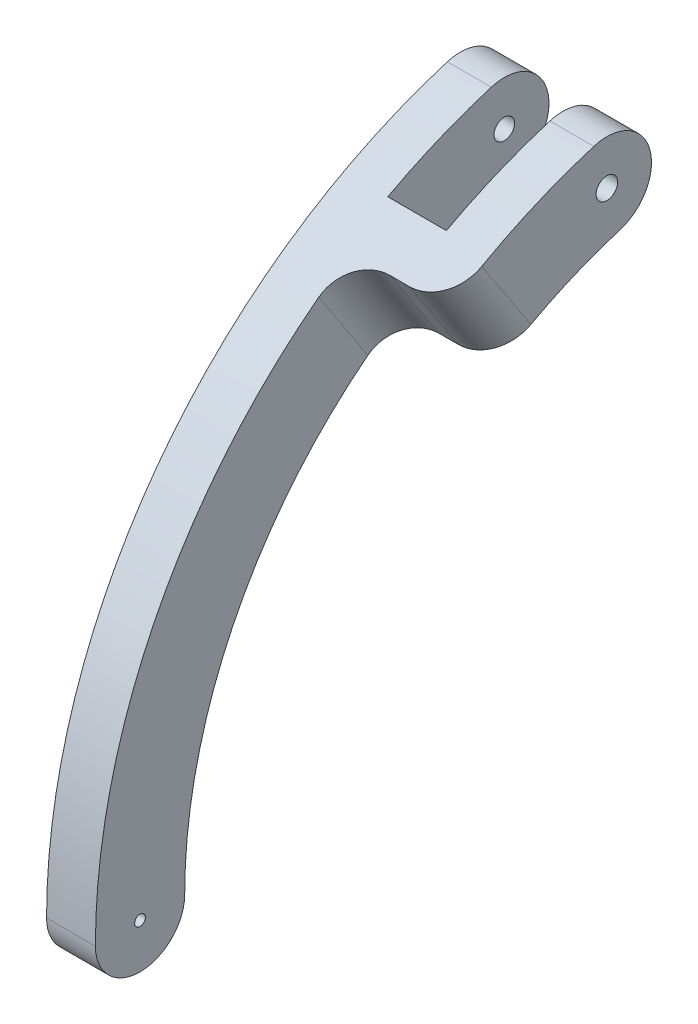
ISO-10303-21;
HEADER;
FILE_DESCRIPTION(('STEP AP214'),'2;1');
FILE_NAME('part.step','',(''),(''),'','','');
FILE_SCHEMA(('AUTOMOTIVE_DESIGN { 1 0 10303 214 1 1 1 1 }'));
ENDSEC;
DATA;
#1=APPLICATION_CONTEXT('core data for automotive mechanical design processes');
#2=APPLICATION_PROTOCOL_DEFINITION('international standard','automotive_design',2000,#1);
#3=PRODUCT_CONTEXT('',#1,'mechanical');
#4=PRODUCT('Part','Part','',(#3));
#5=PRODUCT_RELATED_PRODUCT_CATEGORY('part','',(#4));
#6=PRODUCT_DEFINITION_FORMATION('','',#4);
#7=PRODUCT_DEFINITION_CONTEXT('part definition',#1,'design');
#8=PRODUCT_DEFINITION('design','',#6,#7);
#9=PRODUCT_DEFINITION_SHAPE('','',#8);
#10=(LENGTH_UNIT() NAMED_UNIT(*) SI_UNIT(.MILLI.,.METRE.));
#11=(NAMED_UNIT(*) PLANE_ANGLE_UNIT() SI_UNIT($,.RADIAN.));
#12=(NAMED_UNIT(*) SI_UNIT($,.STERADIAN.) SOLID_ANGLE_UNIT());
#13=UNCERTAINTY_MEASURE_WITH_UNIT(LENGTH_MEASURE(1.E-05),#10,'distance_accuracy_value','');
#14=(GEOMETRIC_REPRESENTATION_CONTEXT(3) GLOBAL_UNCERTAINTY_ASSIGNED_CONTEXT((#13)) GLOBAL_UNIT_ASSIGNED_CONTEXT((#10,
#11,#12)) REPRESENTATION_CONTEXT('',''));
#15=CARTESIAN_POINT('',(0.,0.,0.));
#16=DIRECTION('',(0.,0.,1.));
#17=DIRECTION('',(1.,0.,0.));
#18=AXIS2_PLACEMENT_3D('',#15,#16,#17);
#19=CARTESIAN_POINT('',(5.,51.0253857832654,15.542380952381));
#20=DIRECTION('',(-1.,0.,0.));
#21=DIRECTION('',(0.,0.,1.));
#22=AXIS2_PLACEMENT_3D('',#19,#20,#21);
#23=CYLINDRICAL_SURFACE('',#22,4.572);
#24=DIRECTION('',(-1.,0.,0.));
#25=VECTOR('',#24,1.);
#26=CARTESIAN_POINT('',(5.,55.3989902789739,16.8745850340136));
#27=LINE('',#26,#25);
#28=CARTESIAN_POINT('',(4.5,55.3989902789739,16.8745850340136));
#29=VERTEX_POINT('',#28);
#30=CARTESIAN_POINT('',(0.,55.3989902789739,16.8745850340136));
#31=VERTEX_POINT('',#30);
#32=EDGE_CURVE('E239',#29,#31,#27,.T.);
#33=ORIENTED_EDGE('',*,*,#32,.F.);
#34=CARTESIAN_POINT('',(4.5,51.0253857832654,15.542380952381));
#35=DIRECTION('',(-1.,0.,0.));
#36=DIRECTION('',(0.,0.,1.));
#37=AXIS2_PLACEMENT_3D('',#34,#35,#36);
#38=CIRCLE('',#37,4.572);
#39=CARTESIAN_POINT('',(4.5,46.651781287557,14.2101768707483));
#40=VERTEX_POINT('',#39);
#41=EDGE_CURVE('E168',#29,#40,#38,.T.);
#42=ORIENTED_EDGE('',*,*,#41,.T.);
#43=DIRECTION('',(-1.,0.,0.));
#44=VECTOR('',#43,1.);
#45=CARTESIAN_POINT('',(5.,46.651781287557,14.2101768707483));
#46=LINE('',#45,#44);
#47=CARTESIAN_POINT('',(0.,46.651781287557,14.2101768707483));
#48=VERTEX_POINT('',#47);
#49=EDGE_CURVE('E166',#40,#48,#46,.T.);
#50=ORIENTED_EDGE('',*,*,#49,.T.);
#51=CARTESIAN_POINT('',(0.,51.0253857832654,15.542380952381));
#52=DIRECTION('',(1.,0.,0.));
#53=DIRECTION('',(0.,0.,-1.));
#54=AXIS2_PLACEMENT_3D('',#51,#52,#53);
#55=CIRCLE('',#54,4.572);
#56=EDGE_CURVE('E230',#48,#31,#55,.T.);
#57=ORIENTED_EDGE('',*,*,#56,.T.);
#58=EDGE_LOOP('',(#33,#42,#50,#57));
#59=FACE_BOUND('',#58,.T.);
#60=ADVANCED_FACE('F41',(#59),#23,.T.);
#61=CARTESIAN_POINT('',(5.,0.,26.67));
#62=DIRECTION('',(1.,0.,0.));
#63=DIRECTION('',(0.,0.,-1.));
#64=AXIS2_PLACEMENT_3D('',#61,#62,#63);
#65=PLANE('',#64);
#66=CARTESIAN_POINT('',(5.,0.,0.));
#67=DIRECTION('',(-1.,0.,0.));
#68=DIRECTION('',(0.,0.,1.));
#69=AXIS2_PLACEMENT_3D('',#66,#67,#68);
#70=CIRCLE('',#69,48.768);
#71=CARTESIAN_POINT('',(5.,0.,48.768));
#72=VERTEX_POINT('',#71);
#73=CARTESIAN_POINT('',(5.,38.4411023336171,30.0099895930735));
#74=VERTEX_POINT('',#73);
#75=EDGE_CURVE('E215',#72,#74,#70,.T.);
#76=ORIENTED_EDGE('',*,*,#75,.T.);
#77=DIRECTION('',(0.,-0.836061110184684,-0.548636327667749));
#78=VECTOR('',#77,1.);
#79=CARTESIAN_POINT('',(5.,10.0388102595876,11.3719629811189));
#80=LINE('',#79,#78);
#81=CARTESIAN_POINT('',(5.,46.1077936196312,35.0409918742249));
#82=VERTEX_POINT('',#81);
#83=EDGE_CURVE('E270',#74,#82,#80,.F.);
#84=ORIENTED_EDGE('',*,*,#83,.T.);
#85=CARTESIAN_POINT('',(5.,0.,0.));
#86=DIRECTION('',(1.,0.,0.));
#87=DIRECTION('',(0.,0.,1.));
#88=AXIS2_PLACEMENT_3D('',#85,#86,#87);
#89=CIRCLE('',#88,57.912);
#90=CARTESIAN_POINT('',(5.,0.,57.912));
#91=VERTEX_POINT('',#90);
#92=EDGE_CURVE('E220',#82,#91,#89,.T.);
#93=ORIENTED_EDGE('',*,*,#92,.T.);
#94=CARTESIAN_POINT('',(5.,0.,53.34));
#95=DIRECTION('',(1.,0.,0.));
#96=DIRECTION('',(0.,0.,-1.));
#97=AXIS2_PLACEMENT_3D('',#94,#95,#96);
#98=CIRCLE('',#97,4.572);
#99=EDGE_CURVE('E211',#91,#72,#98,.T.);
#100=ORIENTED_EDGE('',*,*,#99,.T.);
#101=EDGE_LOOP('',(#76,#84,#93,#100));
#102=FACE_BOUND('',#101,.T.);
#103=CARTESIAN_POINT('',(5.,0.,53.34));
#104=DIRECTION('',(1.,0.,0.));
#105=DIRECTION('',(0.,0.,-1.));
#106=AXIS2_PLACEMENT_3D('',#103,#104,#105);
#107=CIRCLE('',#106,0.550000000000003);
#108=CARTESIAN_POINT('',(5.,0.,52.79));
#109=VERTEX_POINT('',#108);
#110=EDGE_CURVE('E199',#109,#109,#107,.T.);
#111=ORIENTED_EDGE('',*,*,#110,.F.);
#112=EDGE_LOOP('',(#111));
#113=FACE_BOUND('',#112,.T.);
#114=ADVANCED_FACE('F313',(#102,#113),#65,.T.);
#115=CARTESIAN_POINT('',(0.,0.,26.67));
#116=DIRECTION('',(1.,0.,0.));
#117=DIRECTION('',(0.,0.,-1.));
#118=AXIS2_PLACEMENT_3D('',#115,#116,#117);
#119=PLANE('',#118);
#120=CARTESIAN_POINT('',(0.,0.,53.34));
#121=DIRECTION('',(1.,0.,0.));
#122=DIRECTION('',(0.,0.,-1.));
#123=AXIS2_PLACEMENT_3D('',#120,#121,#122);
#124=CIRCLE('',#123,4.572);
#125=CARTESIAN_POINT('',(0.,0.,57.912));
#126=VERTEX_POINT('',#125);
#127=CARTESIAN_POINT('',(0.,0.,48.768));
#128=VERTEX_POINT('',#127);
#129=EDGE_CURVE('E210',#126,#128,#124,.T.);
#130=ORIENTED_EDGE('',*,*,#129,.F.);
#131=CARTESIAN_POINT('',(0.,0.,0.));
#132=DIRECTION('',(1.,0.,0.));
#133=DIRECTION('',(0.,0.,1.));
#134=AXIS2_PLACEMENT_3D('',#131,#132,#133);
#135=CIRCLE('',#134,57.912);
#136=EDGE_CURVE('E216',#31,#126,#135,.T.);
#137=ORIENTED_EDGE('',*,*,#136,.F.);
#138=ORIENTED_EDGE('',*,*,#56,.F.);
#139=CARTESIAN_POINT('',(0.,0.,0.));
#140=DIRECTION('',(-1.,0.,0.));
#141=DIRECTION('',(0.,0.,1.));
#142=AXIS2_PLACEMENT_3D('',#139,#140,#141);
#143=CIRCLE('',#142,48.768);
#144=EDGE_CURVE('E227',#128,#48,#143,.T.);
#145=ORIENTED_EDGE('',*,*,#144,.F.);
#146=EDGE_LOOP('',(#130,#137,#138,#145));
#147=FACE_BOUND('',#146,.T.);
#148=CARTESIAN_POINT('',(0.,51.0253857832654,15.542380952381));
#149=DIRECTION('',(1.,0.,0.));
#150=DIRECTION('',(0.,0.,-1.));
#151=AXIS2_PLACEMENT_3D('',#148,#149,#150);
#152=CIRCLE('',#151,1.05);
#153=CARTESIAN_POINT('',(0.,51.0253857832654,14.492380952381));
#154=VERTEX_POINT('',#153);
#155=EDGE_CURVE('E203',#154,#154,#152,.T.);
#156=ORIENTED_EDGE('',*,*,#155,.T.);
#157=EDGE_LOOP('',(#156));
#158=FACE_BOUND('',#157,.T.);
#159=CARTESIAN_POINT('',(0.,0.,53.34));
#160=DIRECTION('',(1.,0.,0.));
#161=DIRECTION('',(0.,0.,-1.));
#162=AXIS2_PLACEMENT_3D('',#159,#160,#161);
#163=CIRCLE('',#162,0.550000000000003);
#164=CARTESIAN_POINT('',(0.,0.,52.79));
#165=VERTEX_POINT('',#164);
#166=EDGE_CURVE('E198',#165,#165,#163,.T.);
#167=ORIENTED_EDGE('',*,*,#166,.T.);
#168=EDGE_LOOP('',(#167));
#169=FACE_BOUND('',#168,.T.);
#170=ADVANCED_FACE('F318',(#147,#158,#169),#119,.F.);
#171=CARTESIAN_POINT('',(5.,0.,53.34));
#172=DIRECTION('',(-1.,0.,0.));
#173=DIRECTION('',(0.,0.,1.));
#174=AXIS2_PLACEMENT_3D('',#171,#172,#173);
#175=CYLINDRICAL_SURFACE('',#174,4.572);
#176=ORIENTED_EDGE('',*,*,#129,.T.);
#177=DIRECTION('',(-1.,0.,0.));
#178=VECTOR('',#177,1.);
#179=CARTESIAN_POINT('',(5.,0.,48.768));
#180=LINE('',#179,#178);
#181=EDGE_CURVE('E248',#72,#128,#180,.T.);
#182=ORIENTED_EDGE('',*,*,#181,.F.);
#183=ORIENTED_EDGE('',*,*,#99,.F.);
#184=DIRECTION('',(-1.,0.,0.));
#185=VECTOR('',#184,1.);
#186=CARTESIAN_POINT('',(5.,0.,57.912));
#187=LINE('',#186,#185);
#188=EDGE_CURVE('E223',#91,#126,#187,.T.);
#189=ORIENTED_EDGE('',*,*,#188,.T.);
#190=EDGE_LOOP('',(#176,#182,#183,#189));
#191=FACE_BOUND('',#190,.T.);
#192=ADVANCED_FACE('F292',(#191),#175,.T.);
#193=CARTESIAN_POINT('',(5.,0.,0.));
#194=DIRECTION('',(-1.,0.,0.));
#195=DIRECTION('',(0.,0.,1.));
#196=AXIS2_PLACEMENT_3D('',#193,#194,#195);
#197=CYLINDRICAL_SURFACE('',#196,48.768);
#198=CARTESIAN_POINT('',(15.,0.,0.));
#199=DIRECTION('',(-1.,0.,0.));
#200=DIRECTION('',(0.,0.,-1.));
#201=AXIS2_PLACEMENT_3D('',#198,#199,#200);
#202=CIRCLE('',#201,48.768);
#203=CARTESIAN_POINT('',(15.,42.8301929549591,23.321500711596));
#204=VERTEX_POINT('',#203);
#205=CARTESIAN_POINT('',(15.,46.651781287557,14.2101768707483));
#206=VERTEX_POINT('',#205);
#207=EDGE_CURVE('E187',#204,#206,#202,.T.);
#208=ORIENTED_EDGE('',*,*,#207,.F.);
#209=CARTESIAN_POINT('',(15.,42.8301929549591,23.321500711596));
#210=CARTESIAN_POINT('',(15.0000121815658,42.7764127888601,23.4202767277682));
#211=CARTESIAN_POINT('',(14.9952890331577,42.7222844230492,23.5188626327073));
#212=CARTESIAN_POINT('',(14.9764431928033,42.6137373798137,23.7149671809633));
#213=CARTESIAN_POINT('',(14.9623207454146,42.559318709979,23.8124858519811));
#214=CARTESIAN_POINT('',(14.9247607016469,42.4506327478518,24.0057057629585));
#215=CARTESIAN_POINT('',(14.901329699486,42.3963653757259,24.1014082393398));
#216=CARTESIAN_POINT('',(14.8453102615447,42.2883671251319,24.2904028164442));
#217=CARTESIAN_POINT('',(14.8127220017254,42.2346362363757,24.3836949634453));
#218=CARTESIAN_POINT('',(14.7385919086943,42.128118448252,24.5672694604092));
#219=CARTESIAN_POINT('',(14.697046366619,42.0753319497547,24.6575505456736));
#220=CARTESIAN_POINT('',(14.6052829373853,41.9711439921967,24.8344809113444));
#221=CARTESIAN_POINT('',(14.5550618462363,41.9197430529771,24.9211288352337));
#222=CARTESIAN_POINT('',(14.446333868917,41.81880837762,25.0901329028123));
#223=CARTESIAN_POINT('',(14.3878318015586,41.7692735766287,25.172491504655));
#224=CARTESIAN_POINT('',(14.2629404081728,41.6724651792581,25.3324342888501));
#225=CARTESIAN_POINT('',(14.1965481847884,41.6251924225214,25.4100167013565));
#226=CARTESIAN_POINT('',(13.9865037549123,41.4876069199725,25.6344878980303));
#227=CARTESIAN_POINT('',(13.8316701703922,41.4012355607191,25.7735864060066));
#228=CARTESIAN_POINT('',(13.4967874547993,41.2423734941752,26.0270427257262));
#229=CARTESIAN_POINT('',(13.3167330656486,41.1698856888318,26.1413953657233));
#230=CARTESIAN_POINT('',(12.9362943477481,41.0413763435968,26.3426945197453));
#231=CARTESIAN_POINT('',(12.7358907287593,40.9853706278016,26.429614702222));
#232=CARTESIAN_POINT('',(12.3206250923403,40.8920825254445,26.5737244480186));
#233=CARTESIAN_POINT('',(12.1057713832712,40.8547894822874,26.6309309335112));
#234=CARTESIAN_POINT('',(11.7413783347004,40.809467770877,26.7003044230343));
#235=CARTESIAN_POINT('',(11.5941057344009,40.7958188492692,26.7211426356511));
#236=CARTESIAN_POINT('',(11.2979090454556,40.7775963062787,26.7489353184245));
#237=CARTESIAN_POINT('',(11.1489875421299,40.7730100737746,26.7559090816406));
#238=CARTESIAN_POINT('',(11.,40.7730282214867,26.7558964277008));
#239=B_SPLINE_CURVE_WITH_KNOTS('',3,(#209,#210,#211,#212,#213,#214,#215,#216,#217,#218,#219,
#220,#221,#222,#223,#224,#225,#226,#227,#228,#229,#230,#231,#232,#233,#234,#235,#236,#237,#238),
.UNSPECIFIED.,.F.,.F.,(4,2,2,2,2,2,2,2,2,2,2,2,2,2,4),(0.,0.337303006389539,0.674597236935861,
1.01165295173073,1.34870219028153,1.68589125680822,2.02320511882105,2.36032349417541,
2.69756604806973,3.37013327016325,4.04284091953263,4.71619232956495,5.38915983930082,
5.83638325715429,6.28298390492815),.UNSPECIFIED.);
#240=CARTESIAN_POINT('',(11.,40.7730282214867,26.7558964277008));
#241=VERTEX_POINT('',#240);
#242=EDGE_CURVE('E63',#204,#241,#239,.T.);
#243=ORIENTED_EDGE('',*,*,#242,.T.);
#244=DIRECTION('',(-1.,0.,0.));
#245=VECTOR('',#244,1.);
#246=CARTESIAN_POINT('',(15.,40.7730282214867,26.7558964277008));
#247=LINE('',#246,#245);
#248=CARTESIAN_POINT('',(9.,40.7730282214867,26.7558964277008));
#249=VERTEX_POINT('',#248);
#250=EDGE_CURVE('E190',#241,#249,#247,.T.);
#251=ORIENTED_EDGE('',*,*,#250,.T.);
#252=CARTESIAN_POINT('',(9.,40.7730282214867,26.7558964277008));
#253=CARTESIAN_POINT('',(8.88750101249402,40.7730317096793,26.7558858272302));
#254=CARTESIAN_POINT('',(8.77500713511228,40.7704243466639,26.7598643070856));
#255=CARTESIAN_POINT('',(8.55082411767978,40.7600160369833,26.775718129916));
#256=CARTESIAN_POINT('',(8.43913493951237,40.7522153379706,26.7875930963344));
#257=CARTESIAN_POINT('',(8.21742744147297,40.7314561932013,26.8191468700817));
#258=CARTESIAN_POINT('',(8.1074079406166,40.7185015880605,26.8388198663922));
#259=CARTESIAN_POINT('',(7.88977104553745,40.6875048637736,26.8857872477433));
#260=CARTESIAN_POINT('',(7.78215362199694,40.6694628067572,26.9130815397097));
#261=CARTESIAN_POINT('',(7.46394202035902,40.6077853893746,27.00613301235));
#262=CARTESIAN_POINT('',(7.25789909730264,40.5565904317826,27.0830716264149));
#263=CARTESIAN_POINT('',(6.86440634060854,40.4350900355563,27.2641361317215));
#264=CARTESIAN_POINT('',(6.67695325928813,40.3647879430329,27.3682572625364));
#265=CARTESIAN_POINT('',(6.32582716859217,40.2064630711044,27.6003229087612));
#266=CARTESIAN_POINT('',(6.16214725136029,40.1184454571707,27.7282604789863));
#267=CARTESIAN_POINT('',(5.8631693304621,39.9265174174691,28.0039134816577));
#268=CARTESIAN_POINT('',(5.7278760790381,39.8226043356507,28.15163221892));
#269=CARTESIAN_POINT('',(5.48965473540508,39.6013691560713,28.4620033372705));
#270=CARTESIAN_POINT('',(5.38669463298308,39.4840604780543,28.6246407412128));
#271=CARTESIAN_POINT('',(5.21587512446005,39.2387896166409,28.9599419978752));
#272=CARTESIAN_POINT('',(5.14799679932643,39.1108332187054,29.132600390439));
#273=CARTESIAN_POINT('',(5.06578855642458,38.8920200048178,29.4236253642593));
#274=CARTESIAN_POINT('',(5.04112371099703,38.8031798670384,29.5406956153022));
#275=CARTESIAN_POINT('',(5.00823113872103,38.6234550851084,29.7753013450045));
#276=CARTESIAN_POINT('',(4.99997966558717,38.53257358726,29.8928359046975));
#277=CARTESIAN_POINT('',(5.,38.4411023336171,30.0099895930735));
#278=B_SPLINE_CURVE_WITH_KNOTS('',3,(#252,#253,#254,#255,#256,#257,#258,#259,#260,#261,#262,
#263,#264,#265,#266,#267,#268,#269,#270,#271,#272,#273,#274,#275,#276,#277),.UNSPECIFIED.,.F.,
.F.,(4,2,2,2,2,2,2,2,2,2,2,2,4),(0.,0.337387217395278,0.674758347103189,1.01187854224819,
1.34899462053765,2.02295805769869,2.69680354390322,3.37045283491373,4.04421481245246,
4.71730763905991,5.39003709788675,5.83622991594024,6.28177672715104),.UNSPECIFIED.);
#279=EDGE_CURVE('E56',#249,#74,#278,.T.);
#280=ORIENTED_EDGE('',*,*,#279,.T.);
#281=ORIENTED_EDGE('',*,*,#75,.F.);
#282=ORIENTED_EDGE('',*,*,#181,.T.);
#283=ORIENTED_EDGE('',*,*,#144,.T.);
#284=ORIENTED_EDGE('',*,*,#49,.F.);
#285=CARTESIAN_POINT('',(4.50000000000001,0.,0.));
#286=DIRECTION('',(-1.,0.,0.));
#287=DIRECTION('',(0.,0.,1.));
#288=AXIS2_PLACEMENT_3D('',#285,#286,#287);
#289=CIRCLE('',#288,48.768);
#290=CARTESIAN_POINT('',(4.5,43.3013482124218,22.4345953158642));
#291=VERTEX_POINT('',#290);
#292=EDGE_CURVE('E151',#40,#291,#289,.F.);
#293=ORIENTED_EDGE('',*,*,#292,.T.);
#294=DIRECTION('',(-1.,0.,0.));
#295=VECTOR('',#294,1.);
#296=CARTESIAN_POINT('',(5.,43.3013482124218,22.4345953158642));
#297=LINE('',#296,#295);
#298=CARTESIAN_POINT('',(10.5,43.3013482124218,22.4345953158642));
#299=VERTEX_POINT('',#298);
#300=EDGE_CURVE('E139',#291,#299,#297,.F.);
#301=ORIENTED_EDGE('',*,*,#300,.T.);
#302=CARTESIAN_POINT('',(10.5,0.,0.));
#303=DIRECTION('',(1.,0.,0.));
#304=DIRECTION('',(0.,0.,-1.));
#305=AXIS2_PLACEMENT_3D('',#302,#303,#304);
#306=CIRCLE('',#305,48.768);
#307=CARTESIAN_POINT('',(10.5,46.651781287557,14.2101768707483));
#308=VERTEX_POINT('',#307);
#309=EDGE_CURVE('E177',#299,#308,#306,.F.);
#310=ORIENTED_EDGE('',*,*,#309,.T.);
#311=EDGE_CURVE('E244',#206,#308,#46,.T.);
#312=ORIENTED_EDGE('',*,*,#311,.F.);
#313=EDGE_LOOP('',(#208,#243,#251,#280,#281,#282,#283,#284,#293,#301,#310,#312));
#314=FACE_BOUND('',#313,.T.);
#315=ADVANCED_FACE('F164',(#314),#197,.F.);
#316=ORIENTED_EDGE('',*,*,#311,.T.);
#317=CARTESIAN_POINT('',(10.5,51.0253857832654,15.542380952381));
#318=DIRECTION('',(1.,0.,0.));
#319=DIRECTION('',(0.,0.,-1.));
#320=AXIS2_PLACEMENT_3D('',#317,#318,#319);
#321=CIRCLE('',#320,4.572);
#322=CARTESIAN_POINT('',(10.5,55.3989902789739,16.8745850340136));
#323=VERTEX_POINT('',#322);
#324=EDGE_CURVE('E150',#308,#323,#321,.T.);
#325=ORIENTED_EDGE('',*,*,#324,.T.);
#326=CARTESIAN_POINT('',(15.,55.3989902789739,16.8745850340136));
#327=VERTEX_POINT('',#326);
#328=EDGE_CURVE('E240',#327,#323,#27,.T.);
#329=ORIENTED_EDGE('',*,*,#328,.F.);
#330=CARTESIAN_POINT('',(15.,51.0253857832654,15.542380952381));
#331=DIRECTION('',(1.,0.,0.));
#332=DIRECTION('',(0.,0.,-1.));
#333=AXIS2_PLACEMENT_3D('',#330,#331,#332);
#334=CIRCLE('',#333,4.572);
#335=EDGE_CURVE('E180',#206,#327,#334,.T.);
#336=ORIENTED_EDGE('',*,*,#335,.F.);
#337=EDGE_LOOP('',(#316,#325,#329,#336));
#338=FACE_BOUND('',#337,.T.);
#339=ADVANCED_FACE('F291',(#338),#23,.T.);
#340=CARTESIAN_POINT('',(5.,0.,0.));
#341=DIRECTION('',(-1.,0.,0.));
#342=DIRECTION('',(0.,0.,1.));
#343=AXIS2_PLACEMENT_3D('',#340,#341,#342);
#344=CYLINDRICAL_SURFACE('',#343,57.912);
#345=DIRECTION('',(-1.,0.,0.));
#346=VECTOR('',#345,1.);
#347=CARTESIAN_POINT('',(15.,48.4179710130154,31.7726270078947));
#348=LINE('',#347,#346);
#349=CARTESIAN_POINT('',(11.,48.4179710130154,31.7726270078947));
#350=VERTEX_POINT('',#349);
#351=CARTESIAN_POINT('',(9.,48.4179710130154,31.7726270078947));
#352=VERTEX_POINT('',#351);
#353=EDGE_CURVE('E194',#350,#352,#348,.T.);
#354=ORIENTED_EDGE('',*,*,#353,.F.);
#355=CARTESIAN_POINT('',(11.,48.4179710130154,31.7726270078947));
#356=CARTESIAN_POINT('',(11.112501163972,48.4179630585636,31.7726346788464));
#357=CARTESIAN_POINT('',(11.2249972179525,48.4205748719332,31.7686588985594));
#358=CARTESIAN_POINT('',(11.4491845330179,48.4309774232356,31.7528004206076));
#359=CARTESIAN_POINT('',(11.5608758322876,48.4387679137878,31.7409181006309));
#360=CARTESIAN_POINT('',(11.7825871052944,48.45945948631,31.7093183271866));
#361=CARTESIAN_POINT('',(11.892608265428,48.4723567454999,31.6896067344532));
#362=CARTESIAN_POINT('',(12.1102483755836,48.5031278866428,31.6424890493224));
#363=CARTESIAN_POINT('',(12.217867354921,48.5210017078275,31.6150830508804));
#364=CARTESIAN_POINT('',(12.5360832101477,48.5818884331414,31.5215083884526));
#365=CARTESIAN_POINT('',(12.7421286619525,48.632175066843,31.4439702469302));
#366=CARTESIAN_POINT('',(13.1356266105201,48.7502246241275,31.2606325064378));
#367=CARTESIAN_POINT('',(13.3230823607317,48.81798448216,31.1548378647494));
#368=CARTESIAN_POINT('',(13.6742306327616,48.9685457968564,30.9176477630495));
#369=CARTESIAN_POINT('',(13.8379281209202,49.0513441017673,30.7862576669073));
#370=CARTESIAN_POINT('',(14.136942447241,49.229090721021,30.5012215358213));
#371=CARTESIAN_POINT('',(14.2722542992767,49.3240411652596,30.347571598788));
#372=CARTESIAN_POINT('',(14.5105519675734,49.5227547711463,30.022204855704));
#373=CARTESIAN_POINT('',(14.6135586704662,49.6265121833456,29.8504998193316));
#374=CARTESIAN_POINT('',(14.7844322419224,49.8394626278524,29.4935717559061));
#375=CARTESIAN_POINT('',(14.8523185278,49.9486526199195,29.308356263263));
#376=CARTESIAN_POINT('',(14.9344002102592,50.1316237910568,28.9938109450065));
#377=CARTESIAN_POINT('',(14.9589916442603,50.2048784485315,28.8667883401954));
#378=CARTESIAN_POINT('',(14.9917897054698,50.3512100351922,28.6107902820034));
#379=CARTESIAN_POINT('',(15.0000198742641,50.4242870684093,28.4818179038994));
#380=CARTESIAN_POINT('',(15.,50.4968842409732,28.3525029927474));
#381=B_SPLINE_CURVE_WITH_KNOTS('',3,(#355,#356,#357,#358,#359,#360,#361,#362,#363,#364,#365,
#366,#367,#368,#369,#370,#371,#372,#373,#374,#375,#376,#377,#378,#379,#380),.UNSPECIFIED.,.F.,
.F.,(4,2,2,2,2,2,2,2,2,2,2,2,4),(0.,0.337393741367434,0.674771366907488,1.01189691726987,
1.34901835121017,2.02299176397614,2.69684701334693,3.37056119896843,4.04439362807238,
4.71778949385368,5.39081265476301,5.83599703438905,6.28054039062029),.UNSPECIFIED.);
#382=CARTESIAN_POINT('',(15.,50.4968842409732,28.3525029927474));
#383=VERTEX_POINT('',#382);
#384=EDGE_CURVE('E71',#350,#383,#381,.T.);
#385=ORIENTED_EDGE('',*,*,#384,.T.);
#386=CARTESIAN_POINT('',(15.,0.,0.));
#387=DIRECTION('',(1.,0.,0.));
#388=DIRECTION('',(0.,0.,-1.));
#389=AXIS2_PLACEMENT_3D('',#386,#387,#388);
#390=CIRCLE('',#389,57.912);
#391=EDGE_CURVE('E184',#327,#383,#390,.T.);
#392=ORIENTED_EDGE('',*,*,#391,.F.);
#393=ORIENTED_EDGE('',*,*,#328,.T.);
#394=CARTESIAN_POINT('',(10.5,0.,0.));
#395=DIRECTION('',(1.,0.,0.));
#396=DIRECTION('',(0.,0.,-1.));
#397=AXIS2_PLACEMENT_3D('',#394,#395,#396);
#398=CIRCLE('',#397,57.912);
#399=CARTESIAN_POINT('',(10.5,50.9803557110197,27.4736796876193));
#400=VERTEX_POINT('',#399);
#401=EDGE_CURVE('E259',#323,#400,#398,.T.);
#402=ORIENTED_EDGE('',*,*,#401,.T.);
#403=DIRECTION('',(-1.,0.,0.));
#404=VECTOR('',#403,1.);
#405=CARTESIAN_POINT('',(5.,50.9803557110197,27.4736796876193));
#406=LINE('',#405,#404);
#407=CARTESIAN_POINT('',(4.49999999999998,50.9803557110197,27.4736796876193));
#408=VERTEX_POINT('',#407);
#409=EDGE_CURVE('E252',#400,#408,#406,.T.);
#410=ORIENTED_EDGE('',*,*,#409,.T.);
#411=CARTESIAN_POINT('',(4.50000000000001,0.,0.));
#412=DIRECTION('',(-1.,0.,0.));
#413=DIRECTION('',(0.,0.,1.));
#414=AXIS2_PLACEMENT_3D('',#411,#412,#413);
#415=CIRCLE('',#414,57.912);
#416=EDGE_CURVE('E157',#408,#29,#415,.T.);
#417=ORIENTED_EDGE('',*,*,#416,.T.);
#418=ORIENTED_EDGE('',*,*,#32,.T.);
#419=ORIENTED_EDGE('',*,*,#136,.T.);
#420=ORIENTED_EDGE('',*,*,#188,.F.);
#421=ORIENTED_EDGE('',*,*,#92,.F.);
#422=CARTESIAN_POINT('',(5.,46.1077936196312,35.0409918742249));
#423=CARTESIAN_POINT('',(4.99998784504616,46.1758538799864,34.9514419545644));
#424=CARTESIAN_POINT('',(5.00472113548672,46.2436475980303,34.8616905052859));
#425=CARTESIAN_POINT('',(5.02360278190742,46.378237564617,34.682434803213));
#426=CARTESIAN_POINT('',(5.03775083301796,46.4450338453873,34.5929305425083));
#427=CARTESIAN_POINT('',(5.07537261290226,46.577121370985,34.4148778206176));
#428=CARTESIAN_POINT('',(5.09883960847792,46.6424136665258,34.3263287166485));
#429=CARTESIAN_POINT('',(5.15493755572512,46.7711049005316,34.1507734776071));
#430=CARTESIAN_POINT('',(5.18756834992342,46.8345038715115,34.0637673160477));
#431=CARTESIAN_POINT('',(5.26178547366234,46.9590182147607,33.8919108179806));
#432=CARTESIAN_POINT('',(5.30337522164879,47.0201327048713,33.80706131824));
#433=CARTESIAN_POINT('',(5.395227155145,47.1396830544936,33.6401630291409));
#434=CARTESIAN_POINT('',(5.44549254351428,47.1981179146238,33.5581152875787));
#435=CARTESIAN_POINT('',(5.55430803276902,47.3118921753681,33.3975190467258));
#436=CARTESIAN_POINT('',(5.61285339889076,47.3672333200094,33.3189685810976));
#437=CARTESIAN_POINT('',(5.73782896225119,47.4745264837964,33.1659137105205));
#438=CARTESIAN_POINT('',(5.80426205587684,47.5264772470694,33.0914108065713));
#439=CARTESIAN_POINT('',(6.01449629495432,47.6765993166961,32.8751016724606));
#440=CARTESIAN_POINT('',(6.16948982217843,47.7693083233371,32.7401155428507));
#441=CARTESIAN_POINT('',(6.5047032508956,47.9377861875492,32.4929361743943));
#442=CARTESIAN_POINT('',(6.68492831650911,48.013551569015,32.3807476130615));
#443=CARTESIAN_POINT('',(7.06567001695441,48.1466206926253,32.182556567128));
#444=CARTESIAN_POINT('',(7.26620151354893,48.2039107829651,32.0965734488784));
#445=CARTESIAN_POINT('',(7.68171103742188,48.2987379880601,31.9537017738913));
#446=CARTESIAN_POINT('',(7.89668069210157,48.3362864412213,31.8967965171122));
#447=CARTESIAN_POINT('',(8.26077497761218,48.3816924944307,31.8278597096963));
#448=CARTESIAN_POINT('',(8.40762704336474,48.3952942398052,31.8071644250548));
#449=CARTESIAN_POINT('',(8.70296578724104,48.413429816255,31.7795474193811));
#450=CARTESIAN_POINT('',(8.85144988754818,48.4179763225003,31.7726064456707));
#451=CARTESIAN_POINT('',(9.,48.4179710130154,31.7726270078947));
#452=B_SPLINE_CURVE_WITH_KNOTS('',3,(#422,#423,#424,#425,#426,#427,#428,#429,#430,#431,#432,
#433,#434,#435,#436,#437,#438,#439,#440,#441,#442,#443,#444,#445,#446,#447,#448,#449,#450,#451),
.UNSPECIFIED.,.F.,.F.,(4,2,2,2,2,2,2,2,2,2,2,2,2,2,4),(0.,0.337333980761031,0.674657038475074,
1.011736813005,1.34881079541763,1.68601362286157,2.02334120564663,2.36047666754039,
2.69773631125885,3.37068246374086,4.04376654952026,4.7173468585567,5.39053987989485,
5.83645491290623,6.28174533157018),.UNSPECIFIED.);
#453=EDGE_CURVE('E11',#82,#352,#452,.T.);
#454=ORIENTED_EDGE('',*,*,#453,.T.);
#455=EDGE_LOOP('',(#354,#385,#392,#393,#402,#410,#417,#418,#419,#420,#421,#454));
#456=FACE_BOUND('',#455,.T.);
#457=ADVANCED_FACE('F323',(#456),#344,.T.);
#458=CARTESIAN_POINT('',(5.,51.0253857832654,15.542380952381));
#459=DIRECTION('',(-1.,0.,0.));
#460=DIRECTION('',(0.,0.,1.));
#461=AXIS2_PLACEMENT_3D('',#458,#459,#460);
#462=CYLINDRICAL_SURFACE('',#461,1.05);
#463=CARTESIAN_POINT('',(4.5,51.0253857832654,15.542380952381));
#464=DIRECTION('',(-1.,0.,0.));
#465=DIRECTION('',(0.,0.,1.));
#466=AXIS2_PLACEMENT_3D('',#463,#464,#465);
#467=CIRCLE('',#466,1.05);
#468=CARTESIAN_POINT('',(4.5,51.0253857832654,16.592380952381));
#469=VERTEX_POINT('',#468);
#470=EDGE_CURVE('E253',#469,#469,#467,.T.);
#471=ORIENTED_EDGE('',*,*,#470,.F.);
#472=EDGE_LOOP('',(#471));
#473=FACE_BOUND('',#472,.T.);
#474=ORIENTED_EDGE('',*,*,#155,.F.);
#475=EDGE_LOOP('',(#474));
#476=FACE_BOUND('',#475,.T.);
#477=ADVANCED_FACE('F328',(#473,#476),#462,.F.);
#478=CARTESIAN_POINT('',(5.,0.,53.34));
#479=DIRECTION('',(-1.,0.,0.));
#480=DIRECTION('',(0.,0.,1.));
#481=AXIS2_PLACEMENT_3D('',#478,#479,#480);
#482=CYLINDRICAL_SURFACE('',#481,0.550000000000003);
#483=ORIENTED_EDGE('',*,*,#110,.T.);
#484=EDGE_LOOP('',(#483));
#485=FACE_BOUND('',#484,.T.);
#486=ORIENTED_EDGE('',*,*,#166,.F.);
#487=EDGE_LOOP('',(#486));
#488=FACE_BOUND('',#487,.T.);
#489=ADVANCED_FACE('F356',(#485,#488),#482,.F.);
#490=CARTESIAN_POINT('',(15.,51.0253857832654,15.542380952381));
#491=DIRECTION('',(1.,0.,0.));
#492=DIRECTION('',(0.,0.,-1.));
#493=AXIS2_PLACEMENT_3D('',#490,#491,#492);
#494=PLANE('',#493);
#495=CARTESIAN_POINT('',(15.,51.0253857832654,15.542380952381));
#496=DIRECTION('',(1.,0.,0.));
#497=DIRECTION('',(0.,0.,-1.));
#498=AXIS2_PLACEMENT_3D('',#495,#496,#497);
#499=CIRCLE('',#498,1.09999999999999);
#500=CARTESIAN_POINT('',(15.,51.0253857832654,14.442380952381));
#501=VERTEX_POINT('',#500);
#502=EDGE_CURVE('E160',#501,#501,#499,.T.);
#503=ORIENTED_EDGE('',*,*,#502,.F.);
#504=EDGE_LOOP('',(#503));
#505=FACE_BOUND('',#504,.T.);
#506=ORIENTED_EDGE('',*,*,#391,.T.);
#507=DIRECTION('',(0.,-0.836061110184684,-0.548636327667749));
#508=VECTOR('',#507,1.);
#509=CARTESIAN_POINT('',(15.,42.9675735321577,23.411651986962));
#510=LINE('',#509,#508);
#511=EDGE_CURVE('E273',#383,#204,#510,.T.);
#512=ORIENTED_EDGE('',*,*,#511,.T.);
#513=ORIENTED_EDGE('',*,*,#207,.T.);
#514=ORIENTED_EDGE('',*,*,#335,.T.);
#515=EDGE_LOOP('',(#506,#512,#513,#514));
#516=FACE_BOUND('',#515,.T.);
#517=ADVANCED_FACE('F334',(#505,#516),#494,.T.);
#518=CARTESIAN_POINT('',(15.,48.4179710130154,31.7726270078947));
#519=DIRECTION('',(0.,0.548636327667749,-0.836061110184684));
#520=DIRECTION('',(0.,0.836061110184684,0.548636327667749));
#521=AXIS2_PLACEMENT_3D('',#518,#519,#520);
#522=PLANE('',#521);
#523=ORIENTED_EDGE('',*,*,#353,.T.);
#524=DIRECTION('',(0.,-0.836061110184684,-0.548636327667749));
#525=VECTOR('',#524,1.);
#526=CARTESIAN_POINT('',(9.,48.4179710130154,31.7726270078947));
#527=LINE('',#526,#525);
#528=EDGE_CURVE('E266',#352,#249,#527,.T.);
#529=ORIENTED_EDGE('',*,*,#528,.T.);
#530=ORIENTED_EDGE('',*,*,#250,.F.);
#531=DIRECTION('',(0.,-0.836061110184684,-0.548636327667749));
#532=VECTOR('',#531,1.);
#533=CARTESIAN_POINT('',(11.,48.4179710130154,31.7726270078947));
#534=LINE('',#533,#532);
#535=EDGE_CURVE('E263',#241,#350,#534,.F.);
#536=ORIENTED_EDGE('',*,*,#535,.T.);
#537=EDGE_LOOP('',(#523,#529,#530,#536));
#538=FACE_BOUND('',#537,.T.);
#539=ADVANCED_FACE('F352',(#538),#522,.F.);
#540=CARTESIAN_POINT('',(10.5,13.3955830456882,-16.4102292459484));
#541=DIRECTION('',(1.,0.,0.));
#542=DIRECTION('',(0.,0.,-1.));
#543=AXIS2_PLACEMENT_3D('',#540,#541,#542);
#544=PLANE('',#543);
#545=CARTESIAN_POINT('',(10.5,51.0253857832654,15.542380952381));
#546=DIRECTION('',(-1.,0.,0.));
#547=DIRECTION('',(0.,0.,1.));
#548=AXIS2_PLACEMENT_3D('',#545,#546,#547);
#549=CIRCLE('',#548,1.09999999999999);
#550=CARTESIAN_POINT('',(10.5,51.0253857832654,16.6423809523809));
#551=VERTEX_POINT('',#550);
#552=EDGE_CURVE('E392',#551,#551,#549,.T.);
#553=ORIENTED_EDGE('',*,*,#552,.F.);
#554=EDGE_LOOP('',(#553));
#555=FACE_BOUND('',#554,.T.);
#556=DIRECTION('',(0.,0.836061110184684,0.548636327667749));
#557=VECTOR('',#556,1.);
#558=CARTESIAN_POINT('',(10.5,4.57940436418375,-2.97534758694742));
#559=LINE('',#558,#557);
#560=EDGE_CURVE('E145',#299,#400,#559,.T.);
#561=ORIENTED_EDGE('',*,*,#560,.T.);
#562=ORIENTED_EDGE('',*,*,#401,.F.);
#563=ORIENTED_EDGE('',*,*,#324,.F.);
#564=ORIENTED_EDGE('',*,*,#309,.F.);
#565=EDGE_LOOP('',(#561,#562,#563,#564));
#566=FACE_BOUND('',#565,.T.);
#567=ADVANCED_FACE('F332',(#555,#566),#544,.F.);
#568=CARTESIAN_POINT('',(4.50000000000001,4.57940436418375,-2.97534758694742));
#569=DIRECTION('',(0.,-0.548636327667749,0.836061110184684));
#570=DIRECTION('',(0.,-0.836061110184684,-0.548636327667749));
#571=AXIS2_PLACEMENT_3D('',#568,#569,#570);
#572=PLANE('',#571);
#573=DIRECTION('',(0.,0.836061110184684,0.548636327667749));
#574=VECTOR('',#573,1.);
#575=CARTESIAN_POINT('',(4.50000000000001,4.57940436418375,-2.97534758694742));
#576=LINE('',#575,#574);
#577=EDGE_CURVE('E142',#291,#408,#576,.T.);
#578=ORIENTED_EDGE('',*,*,#577,.T.);
#579=ORIENTED_EDGE('',*,*,#409,.F.);
#580=ORIENTED_EDGE('',*,*,#560,.F.);
#581=ORIENTED_EDGE('',*,*,#300,.F.);
#582=EDGE_LOOP('',(#578,#579,#580,#581));
#583=FACE_BOUND('',#582,.T.);
#584=ADVANCED_FACE('F141',(#583),#572,.F.);
#585=CARTESIAN_POINT('',(4.50000000000003,13.3955830456882,-16.4102292459484));
#586=DIRECTION('',(-1.,0.,0.));
#587=DIRECTION('',(0.,0.,1.));
#588=AXIS2_PLACEMENT_3D('',#585,#586,#587);
#589=PLANE('',#588);
#590=ORIENTED_EDGE('',*,*,#470,.T.);
#591=EDGE_LOOP('',(#590));
#592=FACE_BOUND('',#591,.T.);
#593=ORIENTED_EDGE('',*,*,#41,.F.);
#594=ORIENTED_EDGE('',*,*,#416,.F.);
#595=ORIENTED_EDGE('',*,*,#577,.F.);
#596=ORIENTED_EDGE('',*,*,#292,.F.);
#597=EDGE_LOOP('',(#593,#594,#595,#596));
#598=FACE_BOUND('',#597,.T.);
#599=ADVANCED_FACE('F154',(#592,#598),#589,.F.);
#600=CARTESIAN_POINT('',(9.,46.2234257023444,35.1168714486334));
#601=DIRECTION('',(0.,-0.836061110184684,-0.548636327667749));
#602=DIRECTION('',(0.,0.548636327667749,-0.836061110184684));
#603=AXIS2_PLACEMENT_3D('',#600,#601,#602);
#604=CYLINDRICAL_SURFACE('',#603,4.);
#605=ORIENTED_EDGE('',*,*,#453,.F.);
#606=ORIENTED_EDGE('',*,*,#83,.F.);
#607=ORIENTED_EDGE('',*,*,#279,.F.);
#608=ORIENTED_EDGE('',*,*,#528,.F.);
#609=EDGE_LOOP('',(#605,#606,#607,#608));
#610=FACE_BOUND('',#609,.T.);
#611=ADVANCED_FACE('F299',(#610),#604,.F.);
#612=CARTESIAN_POINT('',(11.,44.9903861789202,24.7390531644125));
#613=DIRECTION('',(0.,0.836061110184684,0.548636327667749));
#614=DIRECTION('',(0.,-0.548636327667749,0.836061110184684));
#615=AXIS2_PLACEMENT_3D('',#612,#613,#614);
#616=CYLINDRICAL_SURFACE('',#615,4.);
#617=ORIENTED_EDGE('',*,*,#384,.F.);
#618=ORIENTED_EDGE('',*,*,#535,.F.);
#619=ORIENTED_EDGE('',*,*,#242,.F.);
#620=ORIENTED_EDGE('',*,*,#511,.F.);
#621=EDGE_LOOP('',(#617,#618,#619,#620));
#622=FACE_BOUND('',#621,.T.);
#623=ADVANCED_FACE('F43',(#622),#616,.T.);
#624=CARTESIAN_POINT('',(15.2258477564665,51.0253857832654,15.542380952381));
#625=DIRECTION('',(-1.,0.,0.));
#626=DIRECTION('',(0.,0.,1.));
#627=AXIS2_PLACEMENT_3D('',#624,#625,#626);
#628=CYLINDRICAL_SURFACE('',#627,1.09999999999999);
#629=ORIENTED_EDGE('',*,*,#502,.T.);
#630=EDGE_LOOP('',(#629));
#631=FACE_BOUND('',#630,.T.);
#632=ORIENTED_EDGE('',*,*,#552,.T.);
#633=EDGE_LOOP('',(#632));
#634=FACE_BOUND('',#633,.T.);
#635=ADVANCED_FACE('F308',(#631,#634),#628,.F.);
#636=CLOSED_SHELL('',(#60,#114,#170,#192,#315,#339,#457,#477,#489,#517,#539,#567,#584,#599,#611,
#623,#635));
#637=MANIFOLD_SOLID_BREP('B2',#636);
#638=ADVANCED_BREP_SHAPE_REPRESENTATION('',(#18,#637),#14);
#639=SHAPE_DEFINITION_REPRESENTATION(#9,#638);
ENDSEC;
END-ISO-10303-21;
